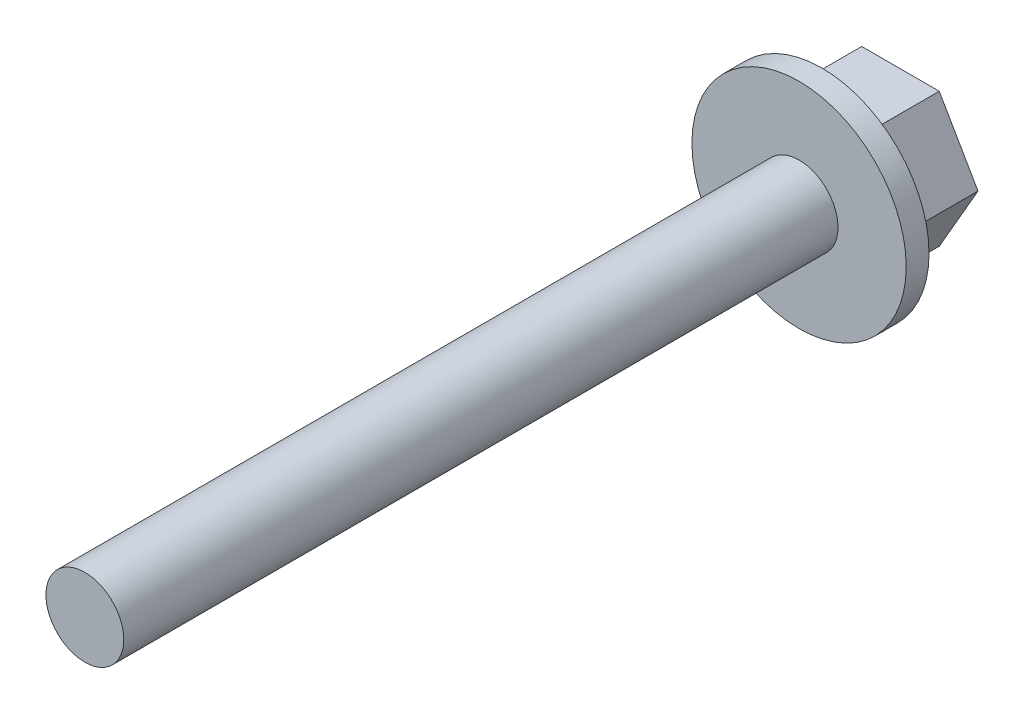
ISO-10303-21;
HEADER;
FILE_DESCRIPTION(('STEP AP214'),'2;1');
FILE_NAME('part.step','',(''),(''),'','','');
FILE_SCHEMA(('AUTOMOTIVE_DESIGN { 1 0 10303 214 1 1 1 1 }'));
ENDSEC;
DATA;
#1=APPLICATION_CONTEXT('core data for automotive mechanical design processes');
#2=APPLICATION_PROTOCOL_DEFINITION('international standard','automotive_design',2000,#1);
#3=PRODUCT_CONTEXT('',#1,'mechanical');
#4=PRODUCT('Part','Part','',(#3));
#5=PRODUCT_RELATED_PRODUCT_CATEGORY('part','',(#4));
#6=PRODUCT_DEFINITION_FORMATION('','',#4);
#7=PRODUCT_DEFINITION_CONTEXT('part definition',#1,'design');
#8=PRODUCT_DEFINITION('design','',#6,#7);
#9=PRODUCT_DEFINITION_SHAPE('','',#8);
#10=(LENGTH_UNIT() NAMED_UNIT(*) SI_UNIT(.MILLI.,.METRE.));
#11=(NAMED_UNIT(*) PLANE_ANGLE_UNIT() SI_UNIT($,.RADIAN.));
#12=(NAMED_UNIT(*) SI_UNIT($,.STERADIAN.) SOLID_ANGLE_UNIT());
#13=UNCERTAINTY_MEASURE_WITH_UNIT(LENGTH_MEASURE(1.E-05),#10,'distance_accuracy_value','');
#14=(GEOMETRIC_REPRESENTATION_CONTEXT(3) GLOBAL_UNCERTAINTY_ASSIGNED_CONTEXT((#13)) GLOBAL_UNIT_ASSIGNED_CONTEXT((#10,
#11,#12)) REPRESENTATION_CONTEXT('',''));
#15=CARTESIAN_POINT('',(0.,0.,0.));
#16=DIRECTION('',(0.,0.,1.));
#17=DIRECTION('',(1.,0.,0.));
#18=AXIS2_PLACEMENT_3D('',#15,#16,#17);
#19=CARTESIAN_POINT('',(1.37848150271715,-2.3876,2.794));
#20=DIRECTION('',(-0.866025403784439,0.5,0.));
#21=DIRECTION('',(-0.5,-0.866025403784439,0.));
#22=AXIS2_PLACEMENT_3D('',#19,#20,#21);
#23=PLANE('',#22);
#24=DIRECTION('',(0.5,0.866025403784439,0.));
#25=VECTOR('',#24,1.);
#26=CARTESIAN_POINT('',(1.37848150271715,-2.3876,0.));
#27=LINE('',#26,#25);
#28=CARTESIAN_POINT('',(1.37848150271715,-2.3876,0.));
#29=VERTEX_POINT('',#28);
#30=CARTESIAN_POINT('',(2.7569630054343,0.,0.));
#31=VERTEX_POINT('',#30);
#32=EDGE_CURVE('E141',#29,#31,#27,.T.);
#33=ORIENTED_EDGE('',*,*,#32,.T.);
#34=DIRECTION('',(0.,0.,-1.));
#35=VECTOR('',#34,1.);
#36=CARTESIAN_POINT('',(2.7569630054343,0.,2.794));
#37=LINE('',#36,#35);
#38=CARTESIAN_POINT('',(2.7569630054343,0.,2.794));
#39=VERTEX_POINT('',#38);
#40=EDGE_CURVE('E50',#39,#31,#37,.T.);
#41=ORIENTED_EDGE('',*,*,#40,.F.);
#42=DIRECTION('',(0.5,0.866025403784439,0.));
#43=VECTOR('',#42,1.);
#44=CARTESIAN_POINT('',(1.37848150271715,-2.3876,2.794));
#45=LINE('',#44,#43);
#46=CARTESIAN_POINT('',(1.37848150271715,-2.3876,2.794));
#47=VERTEX_POINT('',#46);
#48=EDGE_CURVE('E133',#47,#39,#45,.T.);
#49=ORIENTED_EDGE('',*,*,#48,.F.);
#50=DIRECTION('',(0.,0.,-1.));
#51=VECTOR('',#50,1.);
#52=CARTESIAN_POINT('',(1.37848150271715,-2.3876,2.794));
#53=LINE('',#52,#51);
#54=EDGE_CURVE('E140',#47,#29,#53,.T.);
#55=ORIENTED_EDGE('',*,*,#54,.T.);
#56=EDGE_LOOP('',(#33,#41,#49,#55));
#57=FACE_BOUND('',#56,.T.);
#58=ADVANCED_FACE('F47',(#57),#23,.F.);
#59=CARTESIAN_POINT('',(2.7569630054343,0.,2.794));
#60=DIRECTION('',(-0.866025403784439,-0.5,0.));
#61=DIRECTION('',(0.5,-0.866025403784439,0.));
#62=AXIS2_PLACEMENT_3D('',#59,#60,#61);
#63=PLANE('',#62);
#64=DIRECTION('',(-0.5,0.866025403784438,0.));
#65=VECTOR('',#64,1.);
#66=CARTESIAN_POINT('',(2.7569630054343,0.,0.));
#67=LINE('',#66,#65);
#68=CARTESIAN_POINT('',(1.37848150271715,2.3876,0.));
#69=VERTEX_POINT('',#68);
#70=EDGE_CURVE('E144',#31,#69,#67,.T.);
#71=ORIENTED_EDGE('',*,*,#70,.T.);
#72=DIRECTION('',(0.,0.,-1.));
#73=VECTOR('',#72,1.);
#74=CARTESIAN_POINT('',(1.37848150271715,2.3876,2.794));
#75=LINE('',#74,#73);
#76=CARTESIAN_POINT('',(1.37848150271715,2.3876,2.794));
#77=VERTEX_POINT('',#76);
#78=EDGE_CURVE('E119',#77,#69,#75,.T.);
#79=ORIENTED_EDGE('',*,*,#78,.F.);
#80=DIRECTION('',(-0.5,0.866025403784438,0.));
#81=VECTOR('',#80,1.);
#82=CARTESIAN_POINT('',(2.7569630054343,0.,2.794));
#83=LINE('',#82,#81);
#84=EDGE_CURVE('E101',#39,#77,#83,.T.);
#85=ORIENTED_EDGE('',*,*,#84,.F.);
#86=ORIENTED_EDGE('',*,*,#40,.T.);
#87=EDGE_LOOP('',(#71,#79,#85,#86));
#88=FACE_BOUND('',#87,.T.);
#89=ADVANCED_FACE('F154',(#88),#63,.F.);
#90=CARTESIAN_POINT('',(1.37848150271715,2.3876,2.794));
#91=DIRECTION('',(0.,-1.,0.));
#92=DIRECTION('',(1.,0.,0.));
#93=AXIS2_PLACEMENT_3D('',#90,#91,#92);
#94=PLANE('',#93);
#95=DIRECTION('',(-1.,0.,0.));
#96=VECTOR('',#95,1.);
#97=CARTESIAN_POINT('',(1.37848150271715,2.3876,0.));
#98=LINE('',#97,#96);
#99=CARTESIAN_POINT('',(-1.37848150271715,2.3876,0.));
#100=VERTEX_POINT('',#99);
#101=EDGE_CURVE('E116',#69,#100,#98,.T.);
#102=ORIENTED_EDGE('',*,*,#101,.T.);
#103=DIRECTION('',(0.,0.,-1.));
#104=VECTOR('',#103,1.);
#105=CARTESIAN_POINT('',(-1.37848150271715,2.3876,2.794));
#106=LINE('',#105,#104);
#107=CARTESIAN_POINT('',(-1.37848150271715,2.3876,2.794));
#108=VERTEX_POINT('',#107);
#109=EDGE_CURVE('E109',#108,#100,#106,.T.);
#110=ORIENTED_EDGE('',*,*,#109,.F.);
#111=DIRECTION('',(-1.,0.,0.));
#112=VECTOR('',#111,1.);
#113=CARTESIAN_POINT('',(1.37848150271715,2.3876,2.794));
#114=LINE('',#113,#112);
#115=EDGE_CURVE('E114',#77,#108,#114,.T.);
#116=ORIENTED_EDGE('',*,*,#115,.F.);
#117=ORIENTED_EDGE('',*,*,#78,.T.);
#118=EDGE_LOOP('',(#102,#110,#116,#117));
#119=FACE_BOUND('',#118,.T.);
#120=ADVANCED_FACE('F111',(#119),#94,.F.);
#121=CARTESIAN_POINT('',(-1.37848150271715,2.3876,2.794));
#122=DIRECTION('',(0.866025403784439,-0.5,0.));
#123=DIRECTION('',(0.5,0.866025403784438,0.));
#124=AXIS2_PLACEMENT_3D('',#121,#122,#123);
#125=PLANE('',#124);
#126=DIRECTION('',(-0.5,-0.866025403784439,0.));
#127=VECTOR('',#126,1.);
#128=CARTESIAN_POINT('',(-1.37848150271715,2.3876,0.));
#129=LINE('',#128,#127);
#130=CARTESIAN_POINT('',(-2.7569630054343,0.,0.));
#131=VERTEX_POINT('',#130);
#132=EDGE_CURVE('E148',#100,#131,#129,.T.);
#133=ORIENTED_EDGE('',*,*,#132,.T.);
#134=DIRECTION('',(0.,0.,-1.));
#135=VECTOR('',#134,1.);
#136=CARTESIAN_POINT('',(-2.7569630054343,0.,2.794));
#137=LINE('',#136,#135);
#138=CARTESIAN_POINT('',(-2.7569630054343,0.,2.794));
#139=VERTEX_POINT('',#138);
#140=EDGE_CURVE('E120',#139,#131,#137,.T.);
#141=ORIENTED_EDGE('',*,*,#140,.F.);
#142=DIRECTION('',(-0.5,-0.866025403784439,0.));
#143=VECTOR('',#142,1.);
#144=CARTESIAN_POINT('',(-1.37848150271715,2.3876,2.794));
#145=LINE('',#144,#143);
#146=EDGE_CURVE('E123',#108,#139,#145,.T.);
#147=ORIENTED_EDGE('',*,*,#146,.F.);
#148=ORIENTED_EDGE('',*,*,#109,.T.);
#149=EDGE_LOOP('',(#133,#141,#147,#148));
#150=FACE_BOUND('',#149,.T.);
#151=ADVANCED_FACE('F124',(#150),#125,.F.);
#152=CARTESIAN_POINT('',(-2.7569630054343,0.,2.794));
#153=DIRECTION('',(0.866025403784439,0.5,0.));
#154=DIRECTION('',(-0.5,0.866025403784438,0.));
#155=AXIS2_PLACEMENT_3D('',#152,#153,#154);
#156=PLANE('',#155);
#157=DIRECTION('',(0.5,-0.866025403784439,0.));
#158=VECTOR('',#157,1.);
#159=CARTESIAN_POINT('',(-2.7569630054343,0.,0.));
#160=LINE('',#159,#158);
#161=CARTESIAN_POINT('',(-1.37848150271715,-2.3876,0.));
#162=VERTEX_POINT('',#161);
#163=EDGE_CURVE('E86',#131,#162,#160,.T.);
#164=ORIENTED_EDGE('',*,*,#163,.T.);
#165=DIRECTION('',(0.,0.,-1.));
#166=VECTOR('',#165,1.);
#167=CARTESIAN_POINT('',(-1.37848150271715,-2.3876,2.794));
#168=LINE('',#167,#166);
#169=CARTESIAN_POINT('',(-1.37848150271715,-2.3876,2.794));
#170=VERTEX_POINT('',#169);
#171=EDGE_CURVE('E64',#170,#162,#168,.T.);
#172=ORIENTED_EDGE('',*,*,#171,.F.);
#173=DIRECTION('',(0.5,-0.866025403784439,0.));
#174=VECTOR('',#173,1.);
#175=CARTESIAN_POINT('',(-2.7569630054343,0.,2.794));
#176=LINE('',#175,#174);
#177=EDGE_CURVE('E127',#139,#170,#176,.T.);
#178=ORIENTED_EDGE('',*,*,#177,.F.);
#179=ORIENTED_EDGE('',*,*,#140,.T.);
#180=EDGE_LOOP('',(#164,#172,#178,#179));
#181=FACE_BOUND('',#180,.T.);
#182=ADVANCED_FACE('F160',(#181),#156,.F.);
#183=CARTESIAN_POINT('',(-1.37848150271715,-2.3876,2.794));
#184=DIRECTION('',(0.,1.,0.));
#185=DIRECTION('',(0.,0.,1.));
#186=AXIS2_PLACEMENT_3D('',#183,#184,#185);
#187=PLANE('',#186);
#188=DIRECTION('',(1.,0.,0.));
#189=VECTOR('',#188,1.);
#190=CARTESIAN_POINT('',(-1.37848150271715,-2.3876,0.));
#191=LINE('',#190,#189);
#192=EDGE_CURVE('E92',#162,#29,#191,.T.);
#193=ORIENTED_EDGE('',*,*,#192,.T.);
#194=ORIENTED_EDGE('',*,*,#54,.F.);
#195=DIRECTION('',(1.,0.,0.));
#196=VECTOR('',#195,1.);
#197=CARTESIAN_POINT('',(-1.37848150271715,-2.3876,2.794));
#198=LINE('',#197,#196);
#199=EDGE_CURVE('E138',#170,#47,#198,.T.);
#200=ORIENTED_EDGE('',*,*,#199,.F.);
#201=ORIENTED_EDGE('',*,*,#171,.T.);
#202=EDGE_LOOP('',(#193,#194,#200,#201));
#203=FACE_BOUND('',#202,.T.);
#204=ADVANCED_FACE('F161',(#203),#187,.F.);
#205=CARTESIAN_POINT('',(0.,0.,0.));
#206=DIRECTION('',(0.,0.,1.));
#207=DIRECTION('',(1.,0.,0.));
#208=AXIS2_PLACEMENT_3D('',#205,#206,#207);
#209=PLANE('',#208);
#210=ORIENTED_EDGE('',*,*,#32,.F.);
#211=ORIENTED_EDGE('',*,*,#192,.F.);
#212=ORIENTED_EDGE('',*,*,#163,.F.);
#213=ORIENTED_EDGE('',*,*,#132,.F.);
#214=ORIENTED_EDGE('',*,*,#101,.F.);
#215=ORIENTED_EDGE('',*,*,#70,.F.);
#216=EDGE_LOOP('',(#210,#211,#212,#213,#214,#215));
#217=FACE_BOUND('',#216,.T.);
#218=ADVANCED_FACE('F159',(#217),#209,.F.);
#219=CARTESIAN_POINT('',(0.,0.,2.794));
#220=DIRECTION('',(0.,0.,1.));
#221=DIRECTION('',(1.,0.,0.));
#222=AXIS2_PLACEMENT_3D('',#219,#220,#221);
#223=PLANE('',#222);
#224=CARTESIAN_POINT('',(0.,0.,2.794));
#225=DIRECTION('',(0.,0.,1.));
#226=DIRECTION('',(1.,0.,0.));
#227=AXIS2_PLACEMENT_3D('',#224,#225,#226);
#228=CIRCLE('',#227,3.81);
#229=CARTESIAN_POINT('',(3.81,0.,2.794));
#230=VERTEX_POINT('',#229);
#231=EDGE_CURVE('E280',#230,#230,#228,.T.);
#232=ORIENTED_EDGE('',*,*,#231,.F.);
#233=EDGE_LOOP('',(#232));
#234=FACE_BOUND('',#233,.T.);
#235=ORIENTED_EDGE('',*,*,#199,.T.);
#236=ORIENTED_EDGE('',*,*,#48,.T.);
#237=ORIENTED_EDGE('',*,*,#84,.T.);
#238=ORIENTED_EDGE('',*,*,#115,.T.);
#239=ORIENTED_EDGE('',*,*,#146,.T.);
#240=ORIENTED_EDGE('',*,*,#177,.T.);
#241=EDGE_LOOP('',(#235,#236,#237,#238,#239,#240));
#242=FACE_BOUND('',#241,.T.);
#243=ADVANCED_FACE('F130',(#234,#242),#223,.F.);
#244=CARTESIAN_POINT('',(0.,0.,3.6068));
#245=DIRECTION('',(0.,0.,-1.));
#246=DIRECTION('',(-1.,0.,0.));
#247=AXIS2_PLACEMENT_3D('',#244,#245,#246);
#248=CYLINDRICAL_SURFACE('',#247,3.81);
#249=CARTESIAN_POINT('',(0.,0.,3.6068));
#250=DIRECTION('',(0.,0.,1.));
#251=DIRECTION('',(1.,0.,0.));
#252=AXIS2_PLACEMENT_3D('',#249,#250,#251);
#253=CIRCLE('',#252,3.81);
#254=CARTESIAN_POINT('',(3.81,0.,3.6068));
#255=VERTEX_POINT('',#254);
#256=EDGE_CURVE('E145',#255,#255,#253,.T.);
#257=ORIENTED_EDGE('',*,*,#256,.F.);
#258=EDGE_LOOP('',(#257));
#259=FACE_BOUND('',#258,.T.);
#260=ORIENTED_EDGE('',*,*,#231,.T.);
#261=EDGE_LOOP('',(#260));
#262=FACE_BOUND('',#261,.T.);
#263=ADVANCED_FACE('F198',(#259,#262),#248,.T.);
#264=CARTESIAN_POINT('',(0.,0.,3.6068));
#265=DIRECTION('',(0.,0.,1.));
#266=DIRECTION('',(1.,0.,0.));
#267=AXIS2_PLACEMENT_3D('',#264,#265,#266);
#268=PLANE('',#267);
#269=CARTESIAN_POINT('',(0.,0.,3.6068));
#270=DIRECTION('',(0.,0.,1.));
#271=DIRECTION('',(1.,0.,0.));
#272=AXIS2_PLACEMENT_3D('',#269,#270,#271);
#273=CIRCLE('',#272,1.3843);
#274=CARTESIAN_POINT('',(1.3843,0.,3.6068));
#275=VERTEX_POINT('',#274);
#276=EDGE_CURVE('E11',#275,#275,#273,.T.);
#277=ORIENTED_EDGE('',*,*,#276,.F.);
#278=EDGE_LOOP('',(#277));
#279=FACE_BOUND('',#278,.T.);
#280=ORIENTED_EDGE('',*,*,#256,.T.);
#281=EDGE_LOOP('',(#280));
#282=FACE_BOUND('',#281,.T.);
#283=ADVANCED_FACE('F208',(#279,#282),#268,.T.);
#284=CARTESIAN_POINT('',(0.,0.,29.0068));
#285=DIRECTION('',(0.,0.,-1.));
#286=DIRECTION('',(-1.,0.,0.));
#287=AXIS2_PLACEMENT_3D('',#284,#285,#286);
#288=CYLINDRICAL_SURFACE('',#287,1.3843);
#289=CARTESIAN_POINT('',(0.,0.,29.0068));
#290=DIRECTION('',(0.,0.,1.));
#291=DIRECTION('',(1.,0.,0.));
#292=AXIS2_PLACEMENT_3D('',#289,#290,#291);
#293=CIRCLE('',#292,1.3843);
#294=CARTESIAN_POINT('',(1.3843,0.,29.0068));
#295=VERTEX_POINT('',#294);
#296=EDGE_CURVE('E279',#295,#295,#293,.T.);
#297=ORIENTED_EDGE('',*,*,#296,.F.);
#298=EDGE_LOOP('',(#297));
#299=FACE_BOUND('',#298,.T.);
#300=ORIENTED_EDGE('',*,*,#276,.T.);
#301=EDGE_LOOP('',(#300));
#302=FACE_BOUND('',#301,.T.);
#303=ADVANCED_FACE('F218',(#299,#302),#288,.T.);
#304=CARTESIAN_POINT('',(0.,0.,29.0068));
#305=DIRECTION('',(0.,0.,1.));
#306=DIRECTION('',(1.,0.,0.));
#307=AXIS2_PLACEMENT_3D('',#304,#305,#306);
#308=PLANE('',#307);
#309=ORIENTED_EDGE('',*,*,#296,.T.);
#310=EDGE_LOOP('',(#309));
#311=FACE_BOUND('',#310,.T.);
#312=ADVANCED_FACE('F228',(#311),#308,.T.);
#313=CLOSED_SHELL('',(#58,#89,#120,#151,#182,#204,#218,#243,#263,#283,#303,#312));
#314=MANIFOLD_SOLID_BREP('B2',#313);
#315=ADVANCED_BREP_SHAPE_REPRESENTATION('',(#18,#314),#14);
#316=SHAPE_DEFINITION_REPRESENTATION(#9,#315);
ENDSEC;
END-ISO-10303-21;
